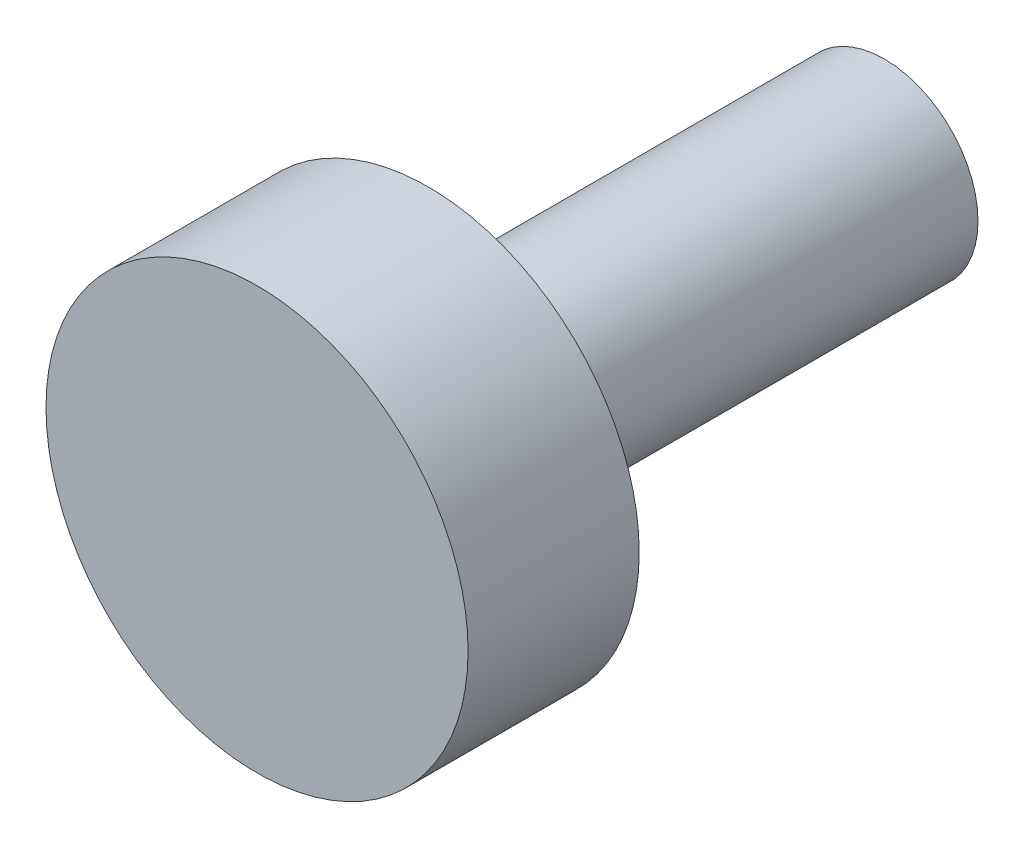
ISO-10303-21;
HEADER;
FILE_DESCRIPTION(('STEP AP214'),'2;1');
FILE_NAME('part.step','',(''),(''),'','','');
FILE_SCHEMA(('AUTOMOTIVE_DESIGN { 1 0 10303 214 1 1 1 1 }'));
ENDSEC;
DATA;
#1=APPLICATION_CONTEXT('core data for automotive mechanical design processes');
#2=APPLICATION_PROTOCOL_DEFINITION('international standard','automotive_design',2000,#1);
#3=PRODUCT_CONTEXT('',#1,'mechanical');
#4=PRODUCT('Part','Part','',(#3));
#5=PRODUCT_RELATED_PRODUCT_CATEGORY('part','',(#4));
#6=PRODUCT_DEFINITION_FORMATION('','',#4);
#7=PRODUCT_DEFINITION_CONTEXT('part definition',#1,'design');
#8=PRODUCT_DEFINITION('design','',#6,#7);
#9=PRODUCT_DEFINITION_SHAPE('','',#8);
#10=(LENGTH_UNIT() NAMED_UNIT(*) SI_UNIT(.MILLI.,.METRE.));
#11=(NAMED_UNIT(*) PLANE_ANGLE_UNIT() SI_UNIT($,.RADIAN.));
#12=(NAMED_UNIT(*) SI_UNIT($,.STERADIAN.) SOLID_ANGLE_UNIT());
#13=UNCERTAINTY_MEASURE_WITH_UNIT(LENGTH_MEASURE(1.E-05),#10,'distance_accuracy_value','');
#14=(GEOMETRIC_REPRESENTATION_CONTEXT(3) GLOBAL_UNCERTAINTY_ASSIGNED_CONTEXT((#13)) GLOBAL_UNIT_ASSIGNED_CONTEXT((#10,
#11,#12)) REPRESENTATION_CONTEXT('',''));
#15=CARTESIAN_POINT('',(0.,0.,0.));
#16=DIRECTION('',(0.,0.,1.));
#17=DIRECTION('',(1.,0.,0.));
#18=AXIS2_PLACEMENT_3D('',#15,#16,#17);
#19=CARTESIAN_POINT('',(0.,0.,9.));
#20=DIRECTION('',(0.,0.,-1.));
#21=DIRECTION('',(-1.,0.,0.));
#22=AXIS2_PLACEMENT_3D('',#19,#20,#21);
#23=CYLINDRICAL_SURFACE('',#22,1.64);
#24=CARTESIAN_POINT('',(0.,0.,9.));
#25=DIRECTION('',(0.,0.,1.));
#26=DIRECTION('',(1.,0.,0.));
#27=AXIS2_PLACEMENT_3D('',#24,#25,#26);
#28=CIRCLE('',#27,1.64);
#29=CARTESIAN_POINT('',(1.64,0.,9.));
#30=VERTEX_POINT('',#29);
#31=EDGE_CURVE('E10',#30,#30,#28,.T.);
#32=ORIENTED_EDGE('',*,*,#31,.F.);
#33=EDGE_LOOP('',(#32));
#34=FACE_BOUND('',#33,.T.);
#35=CARTESIAN_POINT('',(0.,0.,1.));
#36=DIRECTION('',(0.,0.,1.));
#37=DIRECTION('',(1.,0.,0.));
#38=AXIS2_PLACEMENT_3D('',#35,#36,#37);
#39=CIRCLE('',#38,1.64);
#40=CARTESIAN_POINT('',(1.64,0.,1.));
#41=VERTEX_POINT('',#40);
#42=EDGE_CURVE('E44',#41,#41,#39,.T.);
#43=ORIENTED_EDGE('',*,*,#42,.T.);
#44=EDGE_LOOP('',(#43));
#45=FACE_BOUND('',#44,.T.);
#46=ADVANCED_FACE('F41',(#34,#45),#23,.T.);
#47=CARTESIAN_POINT('',(0.,0.,1.));
#48=DIRECTION('',(0.,0.,1.));
#49=DIRECTION('',(1.,0.,0.));
#50=AXIS2_PLACEMENT_3D('',#47,#48,#49);
#51=PLANE('',#50);
#52=ORIENTED_EDGE('',*,*,#42,.F.);
#53=EDGE_LOOP('',(#52));
#54=FACE_BOUND('',#53,.T.);
#55=ADVANCED_FACE('F64',(#54),#51,.F.);
#56=CARTESIAN_POINT('',(0.,0.,12.));
#57=DIRECTION('',(0.,0.,-1.));
#58=DIRECTION('',(-1.,0.,0.));
#59=AXIS2_PLACEMENT_3D('',#56,#57,#58);
#60=CYLINDRICAL_SURFACE('',#59,3.7);
#61=CARTESIAN_POINT('',(0.,0.,12.));
#62=DIRECTION('',(0.,0.,1.));
#63=DIRECTION('',(1.,0.,0.));
#64=AXIS2_PLACEMENT_3D('',#61,#62,#63);
#65=CIRCLE('',#64,3.7);
#66=CARTESIAN_POINT('',(3.7,0.,12.));
#67=VERTEX_POINT('',#66);
#68=EDGE_CURVE('E51',#67,#67,#65,.T.);
#69=ORIENTED_EDGE('',*,*,#68,.F.);
#70=EDGE_LOOP('',(#69));
#71=FACE_BOUND('',#70,.T.);
#72=CARTESIAN_POINT('',(0.,0.,9.));
#73=DIRECTION('',(0.,0.,1.));
#74=DIRECTION('',(1.,0.,0.));
#75=AXIS2_PLACEMENT_3D('',#72,#73,#74);
#76=CIRCLE('',#75,3.7);
#77=CARTESIAN_POINT('',(3.7,0.,9.));
#78=VERTEX_POINT('',#77);
#79=EDGE_CURVE('E53',#78,#78,#76,.T.);
#80=ORIENTED_EDGE('',*,*,#79,.T.);
#81=EDGE_LOOP('',(#80));
#82=FACE_BOUND('',#81,.T.);
#83=ADVANCED_FACE('F61',(#71,#82),#60,.T.);
#84=CARTESIAN_POINT('',(0.,0.,12.));
#85=DIRECTION('',(0.,0.,1.));
#86=DIRECTION('',(1.,0.,0.));
#87=AXIS2_PLACEMENT_3D('',#84,#85,#86);
#88=PLANE('',#87);
#89=ORIENTED_EDGE('',*,*,#68,.T.);
#90=EDGE_LOOP('',(#89));
#91=FACE_BOUND('',#90,.T.);
#92=ADVANCED_FACE('F59',(#91),#88,.T.);
#93=CARTESIAN_POINT('',(0.,0.,9.));
#94=DIRECTION('',(0.,0.,1.));
#95=DIRECTION('',(1.,0.,0.));
#96=AXIS2_PLACEMENT_3D('',#93,#94,#95);
#97=PLANE('',#96);
#98=ORIENTED_EDGE('',*,*,#31,.T.);
#99=EDGE_LOOP('',(#98));
#100=FACE_BOUND('',#99,.T.);
#101=ORIENTED_EDGE('',*,*,#79,.F.);
#102=EDGE_LOOP('',(#101));
#103=FACE_BOUND('',#102,.T.);
#104=ADVANCED_FACE('F68',(#100,#103),#97,.F.);
#105=CLOSED_SHELL('',(#46,#55,#83,#92,#104));
#106=MANIFOLD_SOLID_BREP('B2',#105);
#107=ADVANCED_BREP_SHAPE_REPRESENTATION('',(#18,#106),#14);
#108=SHAPE_DEFINITION_REPRESENTATION(#9,#107);
ENDSEC;
END-ISO-10303-21;
